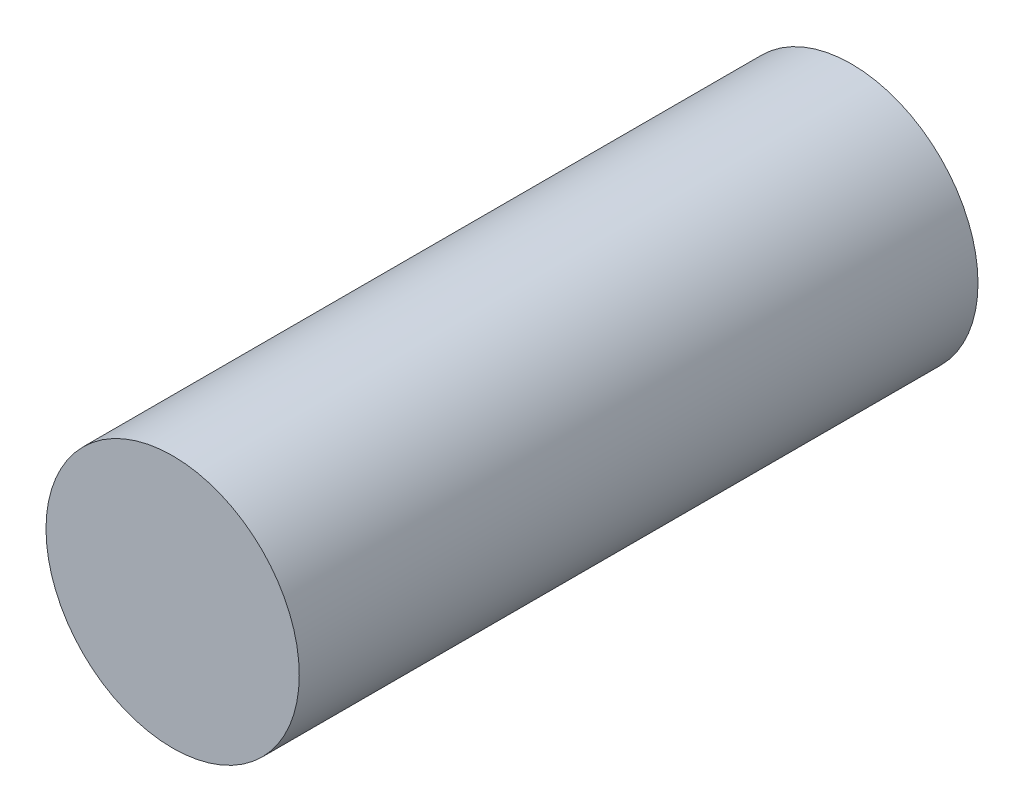
ISO-10303-21;
HEADER;
FILE_DESCRIPTION(('STEP AP214'),'2;1');
FILE_NAME('part.step','',(''),(''),'','','');
FILE_SCHEMA(('AUTOMOTIVE_DESIGN { 1 0 10303 214 1 1 1 1 }'));
ENDSEC;
DATA;
#1=APPLICATION_CONTEXT('core data for automotive mechanical design processes');
#2=APPLICATION_PROTOCOL_DEFINITION('international standard','automotive_design',2000,#1);
#3=PRODUCT_CONTEXT('',#1,'mechanical');
#4=PRODUCT('Part','Part','',(#3));
#5=PRODUCT_RELATED_PRODUCT_CATEGORY('part','',(#4));
#6=PRODUCT_DEFINITION_FORMATION('','',#4);
#7=PRODUCT_DEFINITION_CONTEXT('part definition',#1,'design');
#8=PRODUCT_DEFINITION('design','',#6,#7);
#9=PRODUCT_DEFINITION_SHAPE('','',#8);
#10=(LENGTH_UNIT() NAMED_UNIT(*) SI_UNIT(.MILLI.,.METRE.));
#11=(NAMED_UNIT(*) PLANE_ANGLE_UNIT() SI_UNIT($,.RADIAN.));
#12=(NAMED_UNIT(*) SI_UNIT($,.STERADIAN.) SOLID_ANGLE_UNIT());
#13=UNCERTAINTY_MEASURE_WITH_UNIT(LENGTH_MEASURE(1.E-05),#10,'distance_accuracy_value','');
#14=(GEOMETRIC_REPRESENTATION_CONTEXT(3) GLOBAL_UNCERTAINTY_ASSIGNED_CONTEXT((#13)) GLOBAL_UNIT_ASSIGNED_CONTEXT((#10,
#11,#12)) REPRESENTATION_CONTEXT('',''));
#15=CARTESIAN_POINT('',(0.,0.,0.));
#16=DIRECTION('',(0.,0.,1.));
#17=DIRECTION('',(1.,0.,0.));
#18=AXIS2_PLACEMENT_3D('',#15,#16,#17);
#19=CARTESIAN_POINT('',(0.,0.,13.4));
#20=DIRECTION('',(0.,0.,-1.));
#21=DIRECTION('',(-1.,0.,0.));
#22=AXIS2_PLACEMENT_3D('',#19,#20,#21);
#23=CYLINDRICAL_SURFACE('',#22,2.5);
#24=CARTESIAN_POINT('',(0.,0.,13.4));
#25=DIRECTION('',(0.,0.,1.));
#26=DIRECTION('',(1.,0.,0.));
#27=AXIS2_PLACEMENT_3D('',#24,#25,#26);
#28=CIRCLE('',#27,2.5);
#29=CARTESIAN_POINT('',(2.5,0.,13.4));
#30=VERTEX_POINT('',#29);
#31=EDGE_CURVE('E10',#30,#30,#28,.T.);
#32=ORIENTED_EDGE('',*,*,#31,.F.);
#33=EDGE_LOOP('',(#32));
#34=FACE_BOUND('',#33,.T.);
#35=CARTESIAN_POINT('',(0.,0.,0.));
#36=DIRECTION('',(0.,0.,1.));
#37=DIRECTION('',(1.,0.,0.));
#38=AXIS2_PLACEMENT_3D('',#35,#36,#37);
#39=CIRCLE('',#38,2.5);
#40=CARTESIAN_POINT('',(2.5,0.,0.));
#41=VERTEX_POINT('',#40);
#42=EDGE_CURVE('E42',#41,#41,#39,.T.);
#43=ORIENTED_EDGE('',*,*,#42,.T.);
#44=EDGE_LOOP('',(#43));
#45=FACE_BOUND('',#44,.T.);
#46=ADVANCED_FACE('F39',(#34,#45),#23,.T.);
#47=CARTESIAN_POINT('',(0.,0.,13.4));
#48=DIRECTION('',(0.,0.,1.));
#49=DIRECTION('',(1.,0.,0.));
#50=AXIS2_PLACEMENT_3D('',#47,#48,#49);
#51=PLANE('',#50);
#52=ORIENTED_EDGE('',*,*,#31,.T.);
#53=EDGE_LOOP('',(#52));
#54=FACE_BOUND('',#53,.T.);
#55=ADVANCED_FACE('F54',(#54),#51,.T.);
#56=CARTESIAN_POINT('',(0.,0.,0.));
#57=DIRECTION('',(0.,0.,1.));
#58=DIRECTION('',(1.,0.,0.));
#59=AXIS2_PLACEMENT_3D('',#56,#57,#58);
#60=PLANE('',#59);
#61=ORIENTED_EDGE('',*,*,#42,.F.);
#62=EDGE_LOOP('',(#61));
#63=FACE_BOUND('',#62,.T.);
#64=ADVANCED_FACE('F52',(#63),#60,.F.);
#65=CLOSED_SHELL('',(#46,#55,#64));
#66=MANIFOLD_SOLID_BREP('B2',#65);
#67=ADVANCED_BREP_SHAPE_REPRESENTATION('',(#18,#66),#14);
#68=SHAPE_DEFINITION_REPRESENTATION(#9,#67);
ENDSEC;
END-ISO-10303-21;
